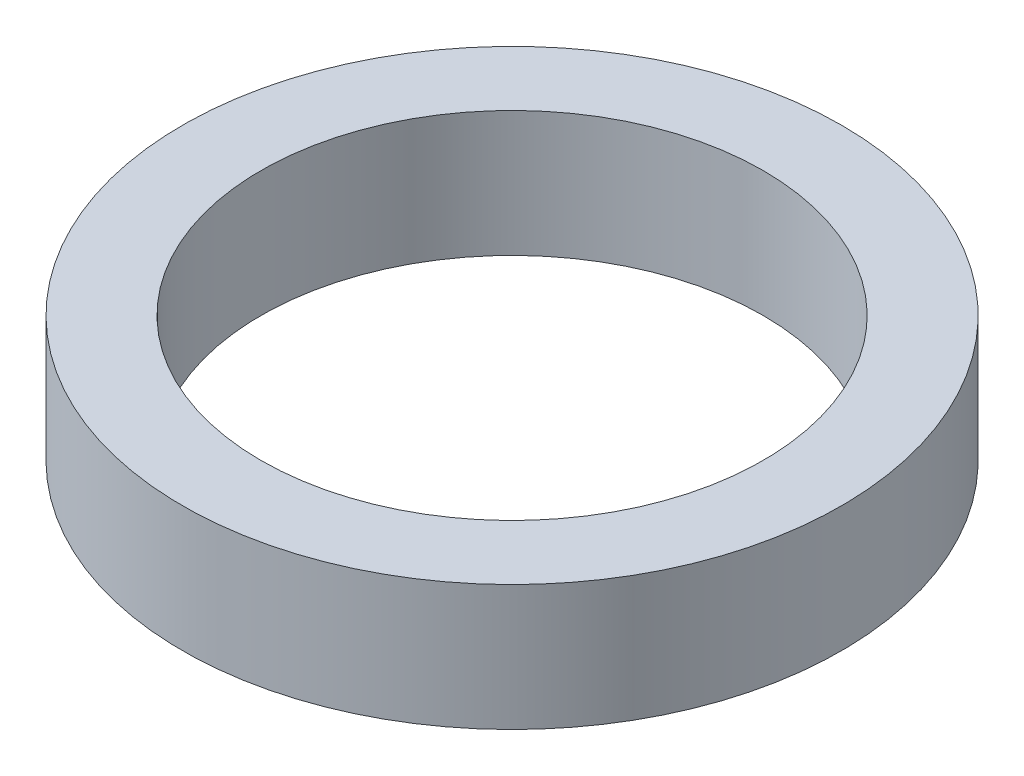
ISO-10303-21;
HEADER;
FILE_DESCRIPTION(('STEP AP214'),'2;1');
FILE_NAME('part.step','',(''),(''),'','','');
FILE_SCHEMA(('AUTOMOTIVE_DESIGN { 1 0 10303 214 1 1 1 1 }'));
ENDSEC;
DATA;
#1=APPLICATION_CONTEXT('core data for automotive mechanical design processes');
#2=APPLICATION_PROTOCOL_DEFINITION('international standard','automotive_design',2000,#1);
#3=PRODUCT_CONTEXT('',#1,'mechanical');
#4=PRODUCT('Part','Part','',(#3));
#5=PRODUCT_RELATED_PRODUCT_CATEGORY('part','',(#4));
#6=PRODUCT_DEFINITION_FORMATION('','',#4);
#7=PRODUCT_DEFINITION_CONTEXT('part definition',#1,'design');
#8=PRODUCT_DEFINITION('design','',#6,#7);
#9=PRODUCT_DEFINITION_SHAPE('','',#8);
#10=(LENGTH_UNIT() NAMED_UNIT(*) SI_UNIT(.MILLI.,.METRE.));
#11=(NAMED_UNIT(*) PLANE_ANGLE_UNIT() SI_UNIT($,.RADIAN.));
#12=(NAMED_UNIT(*) SI_UNIT($,.STERADIAN.) SOLID_ANGLE_UNIT());
#13=UNCERTAINTY_MEASURE_WITH_UNIT(LENGTH_MEASURE(1.E-05),#10,'distance_accuracy_value','');
#14=(GEOMETRIC_REPRESENTATION_CONTEXT(3) GLOBAL_UNCERTAINTY_ASSIGNED_CONTEXT((#13)) GLOBAL_UNIT_ASSIGNED_CONTEXT((#10,
#11,#12)) REPRESENTATION_CONTEXT('',''));
#15=CARTESIAN_POINT('',(0.,0.,0.));
#16=DIRECTION('',(0.,0.,1.));
#17=DIRECTION('',(1.,0.,0.));
#18=AXIS2_PLACEMENT_3D('',#15,#16,#17);
#19=CARTESIAN_POINT('',(5.25,-13.,0.));
#20=DIRECTION('',(0.,-1.,0.));
#21=DIRECTION('',(0.,0.,-1.));
#22=AXIS2_PLACEMENT_3D('',#19,#20,#21);
#23=PLANE('',#22);
#24=CARTESIAN_POINT('',(0.,-13.,0.));
#25=DIRECTION('',(0.,-1.,0.));
#26=DIRECTION('',(0.,0.,-1.));
#27=AXIS2_PLACEMENT_3D('',#24,#25,#26);
#28=CIRCLE('',#27,5.25);
#29=CARTESIAN_POINT('',(0.,-13.,-5.25));
#30=VERTEX_POINT('',#29);
#31=EDGE_CURVE('E45',#30,#30,#28,.T.);
#32=ORIENTED_EDGE('',*,*,#31,.T.);
#33=EDGE_LOOP('',(#32));
#34=FACE_BOUND('',#33,.T.);
#35=CARTESIAN_POINT('',(0.,-13.,0.));
#36=DIRECTION('',(0.,-1.,0.));
#37=DIRECTION('',(0.,0.,-1.));
#38=AXIS2_PLACEMENT_3D('',#35,#36,#37);
#39=CIRCLE('',#38,4.);
#40=CARTESIAN_POINT('',(0.,-13.,-4.));
#41=VERTEX_POINT('',#40);
#42=EDGE_CURVE('E10',#41,#41,#39,.T.);
#43=ORIENTED_EDGE('',*,*,#42,.F.);
#44=EDGE_LOOP('',(#43));
#45=FACE_BOUND('',#44,.T.);
#46=ADVANCED_FACE('F31',(#34,#45),#23,.T.);
#47=CARTESIAN_POINT('',(0.,-500.,0.));
#48=DIRECTION('',(0.,-1.,0.));
#49=DIRECTION('',(0.,0.,-1.));
#50=AXIS2_PLACEMENT_3D('',#47,#48,#49);
#51=CYLINDRICAL_SURFACE('',#50,4.);
#52=ORIENTED_EDGE('',*,*,#42,.T.);
#53=EDGE_LOOP('',(#52));
#54=FACE_BOUND('',#53,.T.);
#55=CARTESIAN_POINT('',(0.,-11.,0.));
#56=DIRECTION('',(0.,-1.,0.));
#57=DIRECTION('',(0.,0.,-1.));
#58=AXIS2_PLACEMENT_3D('',#55,#56,#57);
#59=CIRCLE('',#58,4.);
#60=CARTESIAN_POINT('',(0.,-11.,-4.));
#61=VERTEX_POINT('',#60);
#62=EDGE_CURVE('E37',#61,#61,#59,.T.);
#63=ORIENTED_EDGE('',*,*,#62,.F.);
#64=EDGE_LOOP('',(#63));
#65=FACE_BOUND('',#64,.T.);
#66=ADVANCED_FACE('F61',(#54,#65),#51,.F.);
#67=CARTESIAN_POINT('',(4.,-11.,0.));
#68=DIRECTION('',(0.,1.,0.));
#69=DIRECTION('',(0.,0.,1.));
#70=AXIS2_PLACEMENT_3D('',#67,#68,#69);
#71=PLANE('',#70);
#72=ORIENTED_EDGE('',*,*,#62,.T.);
#73=EDGE_LOOP('',(#72));
#74=FACE_BOUND('',#73,.T.);
#75=CARTESIAN_POINT('',(0.,-11.,0.));
#76=DIRECTION('',(0.,-1.,0.));
#77=DIRECTION('',(0.,0.,-1.));
#78=AXIS2_PLACEMENT_3D('',#75,#76,#77);
#79=CIRCLE('',#78,5.25);
#80=CARTESIAN_POINT('',(0.,-11.,-5.25));
#81=VERTEX_POINT('',#80);
#82=EDGE_CURVE('E41',#81,#81,#79,.T.);
#83=ORIENTED_EDGE('',*,*,#82,.F.);
#84=EDGE_LOOP('',(#83));
#85=FACE_BOUND('',#84,.T.);
#86=ADVANCED_FACE('F55',(#74,#85),#71,.T.);
#87=CARTESIAN_POINT('',(0.,-500.,0.));
#88=DIRECTION('',(0.,-1.,0.));
#89=DIRECTION('',(0.,0.,-1.));
#90=AXIS2_PLACEMENT_3D('',#87,#88,#89);
#91=CYLINDRICAL_SURFACE('',#90,5.25);
#92=ORIENTED_EDGE('',*,*,#82,.T.);
#93=EDGE_LOOP('',(#92));
#94=FACE_BOUND('',#93,.T.);
#95=ORIENTED_EDGE('',*,*,#31,.F.);
#96=EDGE_LOOP('',(#95));
#97=FACE_BOUND('',#96,.T.);
#98=ADVANCED_FACE('F53',(#94,#97),#91,.T.);
#99=CLOSED_SHELL('',(#46,#66,#86,#98));
#100=MANIFOLD_SOLID_BREP('B2',#99);
#101=ADVANCED_BREP_SHAPE_REPRESENTATION('',(#18,#100),#14);
#102=SHAPE_DEFINITION_REPRESENTATION(#9,#101);
ENDSEC;
END-ISO-10303-21;
